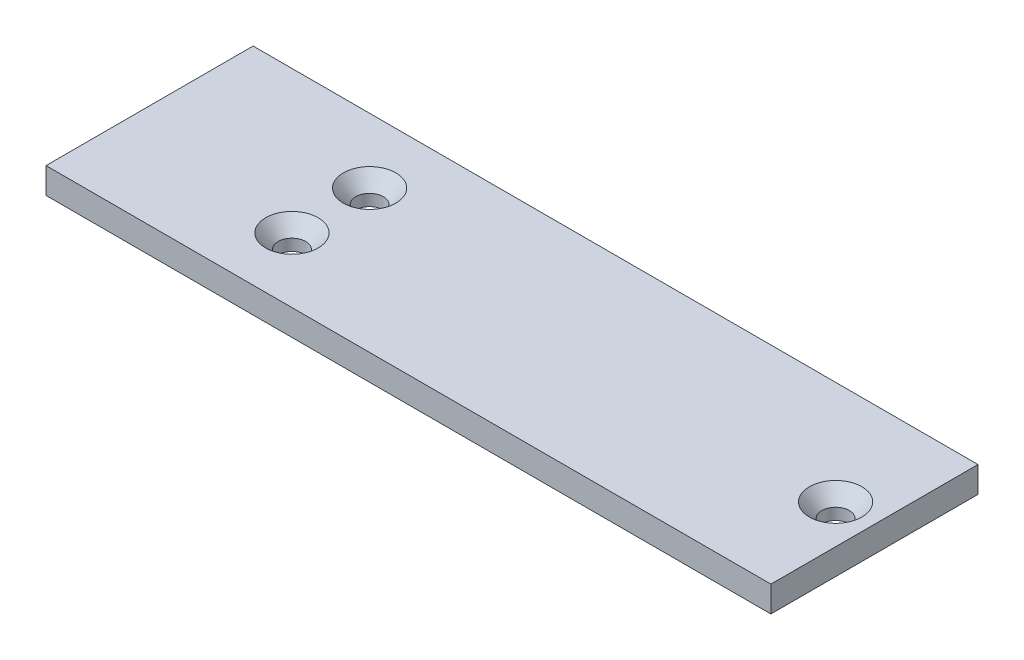
ISO-10303-21;
HEADER;
FILE_DESCRIPTION(('STEP AP214'),'2;1');
FILE_NAME('part.step','',(''),(''),'','','');
FILE_SCHEMA(('AUTOMOTIVE_DESIGN { 1 0 10303 214 1 1 1 1 }'));
ENDSEC;
DATA;
#1=APPLICATION_CONTEXT('core data for automotive mechanical design processes');
#2=APPLICATION_PROTOCOL_DEFINITION('international standard','automotive_design',2000,#1);
#3=PRODUCT_CONTEXT('',#1,'mechanical');
#4=PRODUCT('Part','Part','',(#3));
#5=PRODUCT_RELATED_PRODUCT_CATEGORY('part','',(#4));
#6=PRODUCT_DEFINITION_FORMATION('','',#4);
#7=PRODUCT_DEFINITION_CONTEXT('part definition',#1,'design');
#8=PRODUCT_DEFINITION('design','',#6,#7);
#9=PRODUCT_DEFINITION_SHAPE('','',#8);
#10=(LENGTH_UNIT() NAMED_UNIT(*) SI_UNIT(.MILLI.,.METRE.));
#11=(NAMED_UNIT(*) PLANE_ANGLE_UNIT() SI_UNIT($,.RADIAN.));
#12=(NAMED_UNIT(*) SI_UNIT($,.STERADIAN.) SOLID_ANGLE_UNIT());
#13=UNCERTAINTY_MEASURE_WITH_UNIT(LENGTH_MEASURE(1.E-05),#10,'distance_accuracy_value','');
#14=(GEOMETRIC_REPRESENTATION_CONTEXT(3) GLOBAL_UNCERTAINTY_ASSIGNED_CONTEXT((#13)) GLOBAL_UNIT_ASSIGNED_CONTEXT((#10,
#11,#12)) REPRESENTATION_CONTEXT('',''));
#15=CARTESIAN_POINT('',(0.,0.,0.));
#16=DIRECTION('',(0.,0.,1.));
#17=DIRECTION('',(1.,0.,0.));
#18=AXIS2_PLACEMENT_3D('',#15,#16,#17);
#19=CARTESIAN_POINT('',(-88.9,3.175,25.4));
#20=DIRECTION('',(1.,0.,0.));
#21=DIRECTION('',(0.,0.,-1.));
#22=AXIS2_PLACEMENT_3D('',#19,#20,#21);
#23=PLANE('',#22);
#24=DIRECTION('',(0.,0.,1.));
#25=VECTOR('',#24,1.);
#26=CARTESIAN_POINT('',(-88.9,-3.175,25.4));
#27=LINE('',#26,#25);
#28=CARTESIAN_POINT('',(-88.9,-3.175,-25.4));
#29=VERTEX_POINT('',#28);
#30=CARTESIAN_POINT('',(-88.9,-3.175,25.4));
#31=VERTEX_POINT('',#30);
#32=EDGE_CURVE('E101',#29,#31,#27,.T.);
#33=ORIENTED_EDGE('',*,*,#32,.T.);
#34=DIRECTION('',(0.,-1.,0.));
#35=VECTOR('',#34,1.);
#36=CARTESIAN_POINT('',(-88.9,3.175,25.4));
#37=LINE('',#36,#35);
#38=CARTESIAN_POINT('',(-88.9,3.175,25.4));
#39=VERTEX_POINT('',#38);
#40=EDGE_CURVE('E11',#39,#31,#37,.T.);
#41=ORIENTED_EDGE('',*,*,#40,.F.);
#42=DIRECTION('',(0.,0.,1.));
#43=VECTOR('',#42,1.);
#44=CARTESIAN_POINT('',(-88.9,3.175,25.4));
#45=LINE('',#44,#43);
#46=CARTESIAN_POINT('',(-88.9,3.175,-25.4));
#47=VERTEX_POINT('',#46);
#48=EDGE_CURVE('E88',#47,#39,#45,.T.);
#49=ORIENTED_EDGE('',*,*,#48,.F.);
#50=DIRECTION('',(0.,-1.,0.));
#51=VECTOR('',#50,1.);
#52=CARTESIAN_POINT('',(-88.9,3.175,-25.4));
#53=LINE('',#52,#51);
#54=EDGE_CURVE('E97',#47,#29,#53,.T.);
#55=ORIENTED_EDGE('',*,*,#54,.T.);
#56=EDGE_LOOP('',(#33,#41,#49,#55));
#57=FACE_BOUND('',#56,.T.);
#58=ADVANCED_FACE('F35',(#57),#23,.F.);
#59=CARTESIAN_POINT('',(88.9,3.175,25.4));
#60=DIRECTION('',(0.,0.,-1.));
#61=DIRECTION('',(-1.,0.,0.));
#62=AXIS2_PLACEMENT_3D('',#59,#60,#61);
#63=PLANE('',#62);
#64=DIRECTION('',(1.,0.,0.));
#65=VECTOR('',#64,1.);
#66=CARTESIAN_POINT('',(88.9,-3.175,25.4));
#67=LINE('',#66,#65);
#68=CARTESIAN_POINT('',(88.9,-3.175,25.4));
#69=VERTEX_POINT('',#68);
#70=EDGE_CURVE('E92',#31,#69,#67,.T.);
#71=ORIENTED_EDGE('',*,*,#70,.T.);
#72=DIRECTION('',(0.,-1.,0.));
#73=VECTOR('',#72,1.);
#74=CARTESIAN_POINT('',(88.9,3.175,25.4));
#75=LINE('',#74,#73);
#76=CARTESIAN_POINT('',(88.9,3.175,25.4));
#77=VERTEX_POINT('',#76);
#78=EDGE_CURVE('E44',#77,#69,#75,.T.);
#79=ORIENTED_EDGE('',*,*,#78,.F.);
#80=DIRECTION('',(1.,0.,0.));
#81=VECTOR('',#80,1.);
#82=CARTESIAN_POINT('',(88.9,3.175,25.4));
#83=LINE('',#82,#81);
#84=EDGE_CURVE('E83',#39,#77,#83,.T.);
#85=ORIENTED_EDGE('',*,*,#84,.F.);
#86=ORIENTED_EDGE('',*,*,#40,.T.);
#87=EDGE_LOOP('',(#71,#79,#85,#86));
#88=FACE_BOUND('',#87,.T.);
#89=ADVANCED_FACE('F91',(#88),#63,.F.);
#90=CARTESIAN_POINT('',(88.9,3.175,25.4));
#91=DIRECTION('',(-1.,0.,0.));
#92=DIRECTION('',(0.,0.,1.));
#93=AXIS2_PLACEMENT_3D('',#90,#91,#92);
#94=PLANE('',#93);
#95=DIRECTION('',(0.,0.,-1.));
#96=VECTOR('',#95,1.);
#97=CARTESIAN_POINT('',(88.9,-3.175,25.4));
#98=LINE('',#97,#96);
#99=CARTESIAN_POINT('',(88.9,-3.175,-25.4));
#100=VERTEX_POINT('',#99);
#101=EDGE_CURVE('E70',#69,#100,#98,.T.);
#102=ORIENTED_EDGE('',*,*,#101,.T.);
#103=DIRECTION('',(0.,-1.,0.));
#104=VECTOR('',#103,1.);
#105=CARTESIAN_POINT('',(88.9,3.175,-25.4));
#106=LINE('',#105,#104);
#107=CARTESIAN_POINT('',(88.9,3.175,-25.4));
#108=VERTEX_POINT('',#107);
#109=EDGE_CURVE('E93',#108,#100,#106,.T.);
#110=ORIENTED_EDGE('',*,*,#109,.F.);
#111=DIRECTION('',(0.,0.,-1.));
#112=VECTOR('',#111,1.);
#113=CARTESIAN_POINT('',(88.9,3.175,25.4));
#114=LINE('',#113,#112);
#115=EDGE_CURVE('E86',#77,#108,#114,.T.);
#116=ORIENTED_EDGE('',*,*,#115,.F.);
#117=ORIENTED_EDGE('',*,*,#78,.T.);
#118=EDGE_LOOP('',(#102,#110,#116,#117));
#119=FACE_BOUND('',#118,.T.);
#120=ADVANCED_FACE('F95',(#119),#94,.F.);
#121=CARTESIAN_POINT('',(88.9,3.175,-25.4));
#122=DIRECTION('',(0.,0.,1.));
#123=DIRECTION('',(1.,0.,0.));
#124=AXIS2_PLACEMENT_3D('',#121,#122,#123);
#125=PLANE('',#124);
#126=DIRECTION('',(-1.,0.,0.));
#127=VECTOR('',#126,1.);
#128=CARTESIAN_POINT('',(88.9,-3.175,-25.4));
#129=LINE('',#128,#127);
#130=EDGE_CURVE('E76',#100,#29,#129,.T.);
#131=ORIENTED_EDGE('',*,*,#130,.T.);
#132=ORIENTED_EDGE('',*,*,#54,.F.);
#133=DIRECTION('',(-1.,0.,0.));
#134=VECTOR('',#133,1.);
#135=CARTESIAN_POINT('',(88.9,3.175,-25.4));
#136=LINE('',#135,#134);
#137=EDGE_CURVE('E53',#108,#47,#136,.T.);
#138=ORIENTED_EDGE('',*,*,#137,.F.);
#139=ORIENTED_EDGE('',*,*,#109,.T.);
#140=EDGE_LOOP('',(#131,#132,#138,#139));
#141=FACE_BOUND('',#140,.T.);
#142=ADVANCED_FACE('F144',(#141),#125,.F.);
#143=CARTESIAN_POINT('',(0.,3.175,0.));
#144=DIRECTION('',(0.,1.,0.));
#145=DIRECTION('',(0.,0.,1.));
#146=AXIS2_PLACEMENT_3D('',#143,#144,#145);
#147=PLANE('',#146);
#148=CARTESIAN_POINT('',(79.375,3.175,0.));
#149=DIRECTION('',(0.,1.,0.));
#150=DIRECTION('',(0.,0.,1.));
#151=AXIS2_PLACEMENT_3D('',#148,#149,#150);
#152=CIRCLE('',#151,6.4389);
#153=CARTESIAN_POINT('',(79.375,3.175,6.43890000000001));
#154=VERTEX_POINT('',#153);
#155=EDGE_CURVE('E244',#154,#154,#152,.T.);
#156=ORIENTED_EDGE('',*,*,#155,.F.);
#157=EDGE_LOOP('',(#156));
#158=FACE_BOUND('',#157,.T.);
#159=CARTESIAN_POINT('',(-44.45,3.175,-9.52500000000001));
#160=DIRECTION('',(0.,1.,0.));
#161=DIRECTION('',(0.,0.,1.));
#162=AXIS2_PLACEMENT_3D('',#159,#160,#161);
#163=CIRCLE('',#162,6.4389);
#164=CARTESIAN_POINT('',(-44.45,3.175,-3.08610000000001));
#165=VERTEX_POINT('',#164);
#166=EDGE_CURVE('E121',#165,#165,#163,.T.);
#167=ORIENTED_EDGE('',*,*,#166,.F.);
#168=EDGE_LOOP('',(#167));
#169=FACE_BOUND('',#168,.T.);
#170=CARTESIAN_POINT('',(-44.45,3.175,9.52500000000001));
#171=DIRECTION('',(0.,1.,0.));
#172=DIRECTION('',(0.,0.,1.));
#173=AXIS2_PLACEMENT_3D('',#170,#171,#172);
#174=CIRCLE('',#173,6.4389);
#175=CARTESIAN_POINT('',(-44.45,3.175,15.9639));
#176=VERTEX_POINT('',#175);
#177=EDGE_CURVE('E114',#176,#176,#174,.T.);
#178=ORIENTED_EDGE('',*,*,#177,.F.);
#179=EDGE_LOOP('',(#178));
#180=FACE_BOUND('',#179,.T.);
#181=ORIENTED_EDGE('',*,*,#48,.T.);
#182=ORIENTED_EDGE('',*,*,#84,.T.);
#183=ORIENTED_EDGE('',*,*,#115,.T.);
#184=ORIENTED_EDGE('',*,*,#137,.T.);
#185=EDGE_LOOP('',(#181,#182,#183,#184));
#186=FACE_BOUND('',#185,.T.);
#187=ADVANCED_FACE('F84',(#158,#169,#180,#186),#147,.T.);
#188=CARTESIAN_POINT('',(0.,-3.175,0.));
#189=DIRECTION('',(0.,1.,0.));
#190=DIRECTION('',(0.,0.,1.));
#191=AXIS2_PLACEMENT_3D('',#188,#189,#190);
#192=PLANE('',#191);
#193=CARTESIAN_POINT('',(79.375,-3.175,0.));
#194=DIRECTION('',(0.,1.,0.));
#195=DIRECTION('',(0.,0.,1.));
#196=AXIS2_PLACEMENT_3D('',#193,#194,#195);
#197=CIRCLE('',#196,3.37819999999999);
#198=CARTESIAN_POINT('',(79.375,-3.175,3.3782));
#199=VERTEX_POINT('',#198);
#200=EDGE_CURVE('E38',#199,#199,#197,.T.);
#201=ORIENTED_EDGE('',*,*,#200,.T.);
#202=EDGE_LOOP('',(#201));
#203=FACE_BOUND('',#202,.T.);
#204=CARTESIAN_POINT('',(-44.45,-3.175,-9.52500000000001));
#205=DIRECTION('',(0.,1.,0.));
#206=DIRECTION('',(0.,0.,1.));
#207=AXIS2_PLACEMENT_3D('',#204,#205,#206);
#208=CIRCLE('',#207,3.37819999999999);
#209=CARTESIAN_POINT('',(-44.45,-3.175,-6.14680000000001));
#210=VERTEX_POINT('',#209);
#211=EDGE_CURVE('E112',#210,#210,#208,.T.);
#212=ORIENTED_EDGE('',*,*,#211,.T.);
#213=EDGE_LOOP('',(#212));
#214=FACE_BOUND('',#213,.T.);
#215=CARTESIAN_POINT('',(-44.45,-3.175,9.52500000000001));
#216=DIRECTION('',(0.,1.,0.));
#217=DIRECTION('',(0.,0.,1.));
#218=AXIS2_PLACEMENT_3D('',#215,#216,#217);
#219=CIRCLE('',#218,3.37819999999999);
#220=CARTESIAN_POINT('',(-44.45,-3.175,12.9032));
#221=VERTEX_POINT('',#220);
#222=EDGE_CURVE('E104',#221,#221,#219,.T.);
#223=ORIENTED_EDGE('',*,*,#222,.T.);
#224=EDGE_LOOP('',(#223));
#225=FACE_BOUND('',#224,.T.);
#226=ORIENTED_EDGE('',*,*,#32,.F.);
#227=ORIENTED_EDGE('',*,*,#130,.F.);
#228=ORIENTED_EDGE('',*,*,#101,.F.);
#229=ORIENTED_EDGE('',*,*,#70,.F.);
#230=EDGE_LOOP('',(#226,#227,#228,#229));
#231=FACE_BOUND('',#230,.T.);
#232=ADVANCED_FACE('F143',(#203,#214,#225,#231),#192,.F.);
#233=CARTESIAN_POINT('',(-44.45,3.175,9.52500000000001));
#234=DIRECTION('',(0.,1.,0.));
#235=DIRECTION('',(0.,0.,1.));
#236=AXIS2_PLACEMENT_3D('',#233,#234,#235);
#237=CYLINDRICAL_SURFACE('',#236,3.37819999999999);
#238=CARTESIAN_POINT('',(-44.45,-0.345932583981347,9.52500000000001));
#239=DIRECTION('',(0.,1.,0.));
#240=DIRECTION('',(0.,0.,1.));
#241=AXIS2_PLACEMENT_3D('',#238,#239,#240);
#242=CIRCLE('',#241,3.3782);
#243=CARTESIAN_POINT('',(-44.45,-0.345932583981347,12.9032));
#244=VERTEX_POINT('',#243);
#245=EDGE_CURVE('E111',#244,#244,#242,.T.);
#246=ORIENTED_EDGE('',*,*,#245,.T.);
#247=EDGE_LOOP('',(#246));
#248=FACE_BOUND('',#247,.T.);
#249=ORIENTED_EDGE('',*,*,#222,.F.);
#250=EDGE_LOOP('',(#249));
#251=FACE_BOUND('',#250,.T.);
#252=ADVANCED_FACE('F132',(#248,#251),#237,.F.);
#253=CARTESIAN_POINT('',(-44.45,3.175,9.52500000000001));
#254=DIRECTION('',(0.,1.,0.));
#255=DIRECTION('',(0.,0.,1.));
#256=AXIS2_PLACEMENT_3D('',#253,#254,#255);
#257=CONICAL_SURFACE('',#256,6.4389,0.715584993317675);
#258=ORIENTED_EDGE('',*,*,#245,.F.);
#259=EDGE_LOOP('',(#258));
#260=FACE_BOUND('',#259,.T.);
#261=ORIENTED_EDGE('',*,*,#177,.T.);
#262=EDGE_LOOP('',(#261));
#263=FACE_BOUND('',#262,.T.);
#264=ADVANCED_FACE('F135',(#260,#263),#257,.F.);
#265=CARTESIAN_POINT('',(-44.45,3.175,-9.52500000000001));
#266=DIRECTION('',(0.,1.,0.));
#267=DIRECTION('',(0.,0.,1.));
#268=AXIS2_PLACEMENT_3D('',#265,#266,#267);
#269=CYLINDRICAL_SURFACE('',#268,3.37819999999999);
#270=CARTESIAN_POINT('',(-44.45,-0.345932583981347,-9.52500000000001));
#271=DIRECTION('',(0.,1.,0.));
#272=DIRECTION('',(0.,0.,1.));
#273=AXIS2_PLACEMENT_3D('',#270,#271,#272);
#274=CIRCLE('',#273,3.3782);
#275=CARTESIAN_POINT('',(-44.45,-0.345932583981347,-6.14680000000001));
#276=VERTEX_POINT('',#275);
#277=EDGE_CURVE('E115',#276,#276,#274,.T.);
#278=ORIENTED_EDGE('',*,*,#277,.T.);
#279=EDGE_LOOP('',(#278));
#280=FACE_BOUND('',#279,.T.);
#281=ORIENTED_EDGE('',*,*,#211,.F.);
#282=EDGE_LOOP('',(#281));
#283=FACE_BOUND('',#282,.T.);
#284=ADVANCED_FACE('F138',(#280,#283),#269,.F.);
#285=CARTESIAN_POINT('',(-44.45,3.175,-9.52500000000001));
#286=DIRECTION('',(0.,1.,0.));
#287=DIRECTION('',(0.,0.,1.));
#288=AXIS2_PLACEMENT_3D('',#285,#286,#287);
#289=CONICAL_SURFACE('',#288,6.4389,0.715584993317675);
#290=ORIENTED_EDGE('',*,*,#277,.F.);
#291=EDGE_LOOP('',(#290));
#292=FACE_BOUND('',#291,.T.);
#293=ORIENTED_EDGE('',*,*,#166,.T.);
#294=EDGE_LOOP('',(#293));
#295=FACE_BOUND('',#294,.T.);
#296=ADVANCED_FACE('F206',(#292,#295),#289,.F.);
#297=CARTESIAN_POINT('',(79.375,3.175,0.));
#298=DIRECTION('',(0.,1.,0.));
#299=DIRECTION('',(0.,0.,1.));
#300=AXIS2_PLACEMENT_3D('',#297,#298,#299);
#301=CYLINDRICAL_SURFACE('',#300,3.37819999999999);
#302=CARTESIAN_POINT('',(79.375,-0.345932583981347,0.));
#303=DIRECTION('',(0.,1.,0.));
#304=DIRECTION('',(0.,0.,1.));
#305=AXIS2_PLACEMENT_3D('',#302,#303,#304);
#306=CIRCLE('',#305,3.3782);
#307=CARTESIAN_POINT('',(79.375,-0.345932583981347,3.37820000000001));
#308=VERTEX_POINT('',#307);
#309=EDGE_CURVE('E242',#308,#308,#306,.T.);
#310=ORIENTED_EDGE('',*,*,#309,.T.);
#311=EDGE_LOOP('',(#310));
#312=FACE_BOUND('',#311,.T.);
#313=ORIENTED_EDGE('',*,*,#200,.F.);
#314=EDGE_LOOP('',(#313));
#315=FACE_BOUND('',#314,.T.);
#316=ADVANCED_FACE('F215',(#312,#315),#301,.F.);
#317=CARTESIAN_POINT('',(79.375,3.175,0.));
#318=DIRECTION('',(0.,1.,0.));
#319=DIRECTION('',(0.,0.,1.));
#320=AXIS2_PLACEMENT_3D('',#317,#318,#319);
#321=CONICAL_SURFACE('',#320,6.4389,0.715584993317675);
#322=ORIENTED_EDGE('',*,*,#309,.F.);
#323=EDGE_LOOP('',(#322));
#324=FACE_BOUND('',#323,.T.);
#325=ORIENTED_EDGE('',*,*,#155,.T.);
#326=EDGE_LOOP('',(#325));
#327=FACE_BOUND('',#326,.T.);
#328=ADVANCED_FACE('F225',(#324,#327),#321,.F.);
#329=CLOSED_SHELL('',(#58,#89,#120,#142,#187,#232,#252,#264,#284,#296,#316,#328));
#330=MANIFOLD_SOLID_BREP('B2',#329);
#331=ADVANCED_BREP_SHAPE_REPRESENTATION('',(#18,#330),#14);
#332=SHAPE_DEFINITION_REPRESENTATION(#9,#331);
ENDSEC;
END-ISO-10303-21;
